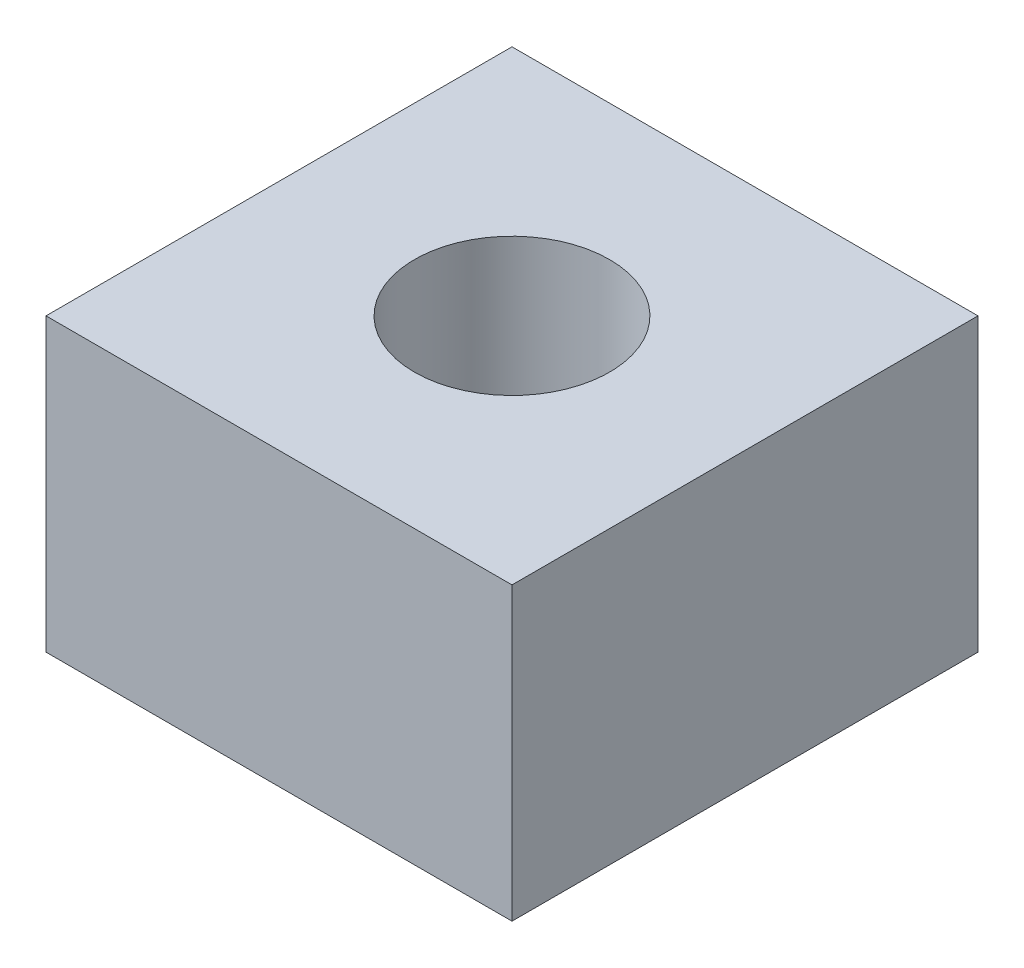
ISO-10303-21;
HEADER;
FILE_DESCRIPTION(('STEP AP214'),'2;1');
FILE_NAME('part.step','',(''),(''),'','','');
FILE_SCHEMA(('AUTOMOTIVE_DESIGN { 1 0 10303 214 1 1 1 1 }'));
ENDSEC;
DATA;
#1=APPLICATION_CONTEXT('core data for automotive mechanical design processes');
#2=APPLICATION_PROTOCOL_DEFINITION('international standard','automotive_design',2000,#1);
#3=PRODUCT_CONTEXT('',#1,'mechanical');
#4=PRODUCT('Part','Part','',(#3));
#5=PRODUCT_RELATED_PRODUCT_CATEGORY('part','',(#4));
#6=PRODUCT_DEFINITION_FORMATION('','',#4);
#7=PRODUCT_DEFINITION_CONTEXT('part definition',#1,'design');
#8=PRODUCT_DEFINITION('design','',#6,#7);
#9=PRODUCT_DEFINITION_SHAPE('','',#8);
#10=(LENGTH_UNIT() NAMED_UNIT(*) SI_UNIT(.MILLI.,.METRE.));
#11=(NAMED_UNIT(*) PLANE_ANGLE_UNIT() SI_UNIT($,.RADIAN.));
#12=(NAMED_UNIT(*) SI_UNIT($,.STERADIAN.) SOLID_ANGLE_UNIT());
#13=UNCERTAINTY_MEASURE_WITH_UNIT(LENGTH_MEASURE(1.E-05),#10,'distance_accuracy_value','');
#14=(GEOMETRIC_REPRESENTATION_CONTEXT(3) GLOBAL_UNCERTAINTY_ASSIGNED_CONTEXT((#13)) GLOBAL_UNIT_ASSIGNED_CONTEXT((#10,
#11,#12)) REPRESENTATION_CONTEXT('',''));
#15=CARTESIAN_POINT('',(0.,0.,0.));
#16=DIRECTION('',(0.,0.,1.));
#17=DIRECTION('',(1.,0.,0.));
#18=AXIS2_PLACEMENT_3D('',#15,#16,#17);
#19=CARTESIAN_POINT('',(0.,5.,0.));
#20=DIRECTION('',(0.,-1.,0.));
#21=DIRECTION('',(0.,0.,-1.));
#22=AXIS2_PLACEMENT_3D('',#19,#20,#21);
#23=PLANE('',#22);
#24=DIRECTION('',(1.,0.,0.));
#25=VECTOR('',#24,1.);
#26=CARTESIAN_POINT('',(12.4707632451474,5.,-9.39943710382854));
#27=LINE('',#26,#25);
#28=CARTESIAN_POINT('',(4.4707632451474,5.,-9.39943710382854));
#29=VERTEX_POINT('',#28);
#30=CARTESIAN_POINT('',(12.4707632451474,5.,-9.39943710382854));
#31=VERTEX_POINT('',#30);
#32=EDGE_CURVE('E91',#29,#31,#27,.T.);
#33=ORIENTED_EDGE('',*,*,#32,.T.);
#34=DIRECTION('',(0.,0.,-1.));
#35=VECTOR('',#34,1.);
#36=CARTESIAN_POINT('',(12.4707632451474,5.,-13.3994371038285));
#37=LINE('',#36,#35);
#38=CARTESIAN_POINT('',(12.4707632451474,5.,-17.3994371038285));
#39=VERTEX_POINT('',#38);
#40=EDGE_CURVE('E85',#31,#39,#37,.T.);
#41=ORIENTED_EDGE('',*,*,#40,.T.);
#42=DIRECTION('',(-1.,0.,0.));
#43=VECTOR('',#42,1.);
#44=CARTESIAN_POINT('',(4.4707632451474,5.,-17.3994371038285));
#45=LINE('',#44,#43);
#46=CARTESIAN_POINT('',(4.4707632451474,5.,-17.3994371038285));
#47=VERTEX_POINT('',#46);
#48=EDGE_CURVE('E88',#39,#47,#45,.T.);
#49=ORIENTED_EDGE('',*,*,#48,.T.);
#50=DIRECTION('',(0.,0.,1.));
#51=VECTOR('',#50,1.);
#52=CARTESIAN_POINT('',(4.4707632451474,5.,-13.3994371038285));
#53=LINE('',#52,#51);
#54=EDGE_CURVE('E57',#47,#29,#53,.T.);
#55=ORIENTED_EDGE('',*,*,#54,.T.);
#56=EDGE_LOOP('',(#33,#41,#49,#55));
#57=FACE_BOUND('',#56,.T.);
#58=CARTESIAN_POINT('',(8.4707632451474,5.,-13.3994371038285));
#59=DIRECTION('',(0.,1.,0.));
#60=DIRECTION('',(0.,0.,1.));
#61=AXIS2_PLACEMENT_3D('',#58,#59,#60);
#62=CIRCLE('',#61,1.675);
#63=CARTESIAN_POINT('',(8.4707632451474,5.,-11.7244371038285));
#64=VERTEX_POINT('',#63);
#65=EDGE_CURVE('E113',#64,#64,#62,.T.);
#66=ORIENTED_EDGE('',*,*,#65,.F.);
#67=EDGE_LOOP('',(#66));
#68=FACE_BOUND('',#67,.T.);
#69=ADVANCED_FACE('F39',(#57,#68),#23,.F.);
#70=CARTESIAN_POINT('',(0.,0.,0.));
#71=DIRECTION('',(0.,-1.,0.));
#72=DIRECTION('',(0.,0.,-1.));
#73=AXIS2_PLACEMENT_3D('',#70,#71,#72);
#74=PLANE('',#73);
#75=DIRECTION('',(1.,0.,0.));
#76=VECTOR('',#75,1.);
#77=CARTESIAN_POINT('',(12.4707632451474,0.,-9.39943710382854));
#78=LINE('',#77,#76);
#79=CARTESIAN_POINT('',(4.4707632451474,0.,-9.39943710382854));
#80=VERTEX_POINT('',#79);
#81=CARTESIAN_POINT('',(12.4707632451474,0.,-9.39943710382854));
#82=VERTEX_POINT('',#81);
#83=EDGE_CURVE('E109',#80,#82,#78,.T.);
#84=ORIENTED_EDGE('',*,*,#83,.F.);
#85=DIRECTION('',(0.,0.,1.));
#86=VECTOR('',#85,1.);
#87=CARTESIAN_POINT('',(4.4707632451474,0.,-9.39943710382854));
#88=LINE('',#87,#86);
#89=CARTESIAN_POINT('',(4.4707632451474,0.,-17.3994371038285));
#90=VERTEX_POINT('',#89);
#91=EDGE_CURVE('E74',#90,#80,#88,.T.);
#92=ORIENTED_EDGE('',*,*,#91,.F.);
#93=DIRECTION('',(-1.,0.,0.));
#94=VECTOR('',#93,1.);
#95=CARTESIAN_POINT('',(4.4707632451474,0.,-17.3994371038285));
#96=LINE('',#95,#94);
#97=CARTESIAN_POINT('',(12.4707632451474,0.,-17.3994371038285));
#98=VERTEX_POINT('',#97);
#99=EDGE_CURVE('E116',#98,#90,#96,.T.);
#100=ORIENTED_EDGE('',*,*,#99,.F.);
#101=DIRECTION('',(0.,0.,-1.));
#102=VECTOR('',#101,1.);
#103=CARTESIAN_POINT('',(12.4707632451474,0.,-17.3994371038285));
#104=LINE('',#103,#102);
#105=EDGE_CURVE('E97',#82,#98,#104,.T.);
#106=ORIENTED_EDGE('',*,*,#105,.F.);
#107=EDGE_LOOP('',(#84,#92,#100,#106));
#108=FACE_BOUND('',#107,.T.);
#109=CARTESIAN_POINT('',(8.4707632451474,0.,-13.3994371038285));
#110=DIRECTION('',(0.,1.,0.));
#111=DIRECTION('',(0.,0.,1.));
#112=AXIS2_PLACEMENT_3D('',#109,#110,#111);
#113=CIRCLE('',#112,1.675);
#114=CARTESIAN_POINT('',(8.4707632451474,0.,-11.7244371038285));
#115=VERTEX_POINT('',#114);
#116=EDGE_CURVE('E128',#115,#115,#113,.T.);
#117=ORIENTED_EDGE('',*,*,#116,.T.);
#118=EDGE_LOOP('',(#117));
#119=FACE_BOUND('',#118,.T.);
#120=ADVANCED_FACE('F139',(#108,#119),#74,.T.);
#121=CARTESIAN_POINT('',(12.4707632451474,5.,-9.39943710382854));
#122=DIRECTION('',(0.,0.,-1.));
#123=DIRECTION('',(-1.,0.,0.));
#124=AXIS2_PLACEMENT_3D('',#121,#122,#123);
#125=PLANE('',#124);
#126=ORIENTED_EDGE('',*,*,#83,.T.);
#127=DIRECTION('',(0.,-1.,0.));
#128=VECTOR('',#127,1.);
#129=CARTESIAN_POINT('',(12.4707632451474,5.,-9.39943710382854));
#130=LINE('',#129,#128);
#131=EDGE_CURVE('E11',#31,#82,#130,.T.);
#132=ORIENTED_EDGE('',*,*,#131,.F.);
#133=ORIENTED_EDGE('',*,*,#32,.F.);
#134=DIRECTION('',(0.,-1.,0.));
#135=VECTOR('',#134,1.);
#136=CARTESIAN_POINT('',(4.4707632451474,5.,-9.39943710382854));
#137=LINE('',#136,#135);
#138=EDGE_CURVE('E105',#29,#80,#137,.T.);
#139=ORIENTED_EDGE('',*,*,#138,.T.);
#140=EDGE_LOOP('',(#126,#132,#133,#139));
#141=FACE_BOUND('',#140,.T.);
#142=ADVANCED_FACE('F41',(#141),#125,.F.);
#143=CARTESIAN_POINT('',(12.4707632451474,5.,-17.3994371038285));
#144=DIRECTION('',(-1.,0.,0.));
#145=DIRECTION('',(0.,0.,1.));
#146=AXIS2_PLACEMENT_3D('',#143,#144,#145);
#147=PLANE('',#146);
#148=ORIENTED_EDGE('',*,*,#105,.T.);
#149=DIRECTION('',(0.,-1.,0.));
#150=VECTOR('',#149,1.);
#151=CARTESIAN_POINT('',(12.4707632451474,5.,-17.3994371038285));
#152=LINE('',#151,#150);
#153=EDGE_CURVE('E49',#39,#98,#152,.T.);
#154=ORIENTED_EDGE('',*,*,#153,.F.);
#155=ORIENTED_EDGE('',*,*,#40,.F.);
#156=ORIENTED_EDGE('',*,*,#131,.T.);
#157=EDGE_LOOP('',(#148,#154,#155,#156));
#158=FACE_BOUND('',#157,.T.);
#159=ADVANCED_FACE('F96',(#158),#147,.F.);
#160=CARTESIAN_POINT('',(4.4707632451474,5.,-17.3994371038285));
#161=DIRECTION('',(0.,0.,1.));
#162=DIRECTION('',(1.,0.,0.));
#163=AXIS2_PLACEMENT_3D('',#160,#161,#162);
#164=PLANE('',#163);
#165=ORIENTED_EDGE('',*,*,#99,.T.);
#166=DIRECTION('',(0.,-1.,0.));
#167=VECTOR('',#166,1.);
#168=CARTESIAN_POINT('',(4.4707632451474,5.,-17.3994371038285));
#169=LINE('',#168,#167);
#170=EDGE_CURVE('E100',#47,#90,#169,.T.);
#171=ORIENTED_EDGE('',*,*,#170,.F.);
#172=ORIENTED_EDGE('',*,*,#48,.F.);
#173=ORIENTED_EDGE('',*,*,#153,.T.);
#174=EDGE_LOOP('',(#165,#171,#172,#173));
#175=FACE_BOUND('',#174,.T.);
#176=ADVANCED_FACE('F101',(#175),#164,.F.);
#177=CARTESIAN_POINT('',(4.4707632451474,5.,-9.39943710382854));
#178=DIRECTION('',(1.,0.,0.));
#179=DIRECTION('',(0.,0.,-1.));
#180=AXIS2_PLACEMENT_3D('',#177,#178,#179);
#181=PLANE('',#180);
#182=ORIENTED_EDGE('',*,*,#91,.T.);
#183=ORIENTED_EDGE('',*,*,#138,.F.);
#184=ORIENTED_EDGE('',*,*,#54,.F.);
#185=ORIENTED_EDGE('',*,*,#170,.T.);
#186=EDGE_LOOP('',(#182,#183,#184,#185));
#187=FACE_BOUND('',#186,.T.);
#188=ADVANCED_FACE('F124',(#187),#181,.F.);
#189=CARTESIAN_POINT('',(8.4707632451474,5.,-13.3994371038285));
#190=DIRECTION('',(0.,-1.,0.));
#191=DIRECTION('',(0.,0.,-1.));
#192=AXIS2_PLACEMENT_3D('',#189,#190,#191);
#193=CYLINDRICAL_SURFACE('',#192,1.675);
#194=ORIENTED_EDGE('',*,*,#65,.T.);
#195=EDGE_LOOP('',(#194));
#196=FACE_BOUND('',#195,.T.);
#197=ORIENTED_EDGE('',*,*,#116,.F.);
#198=EDGE_LOOP('',(#197));
#199=FACE_BOUND('',#198,.T.);
#200=ADVANCED_FACE('F136',(#196,#199),#193,.F.);
#201=CLOSED_SHELL('',(#69,#120,#142,#159,#176,#188,#200));
#202=MANIFOLD_SOLID_BREP('B2',#201);
#203=ADVANCED_BREP_SHAPE_REPRESENTATION('',(#18,#202),#14);
#204=SHAPE_DEFINITION_REPRESENTATION(#9,#203);
ENDSEC;
END-ISO-10303-21;
